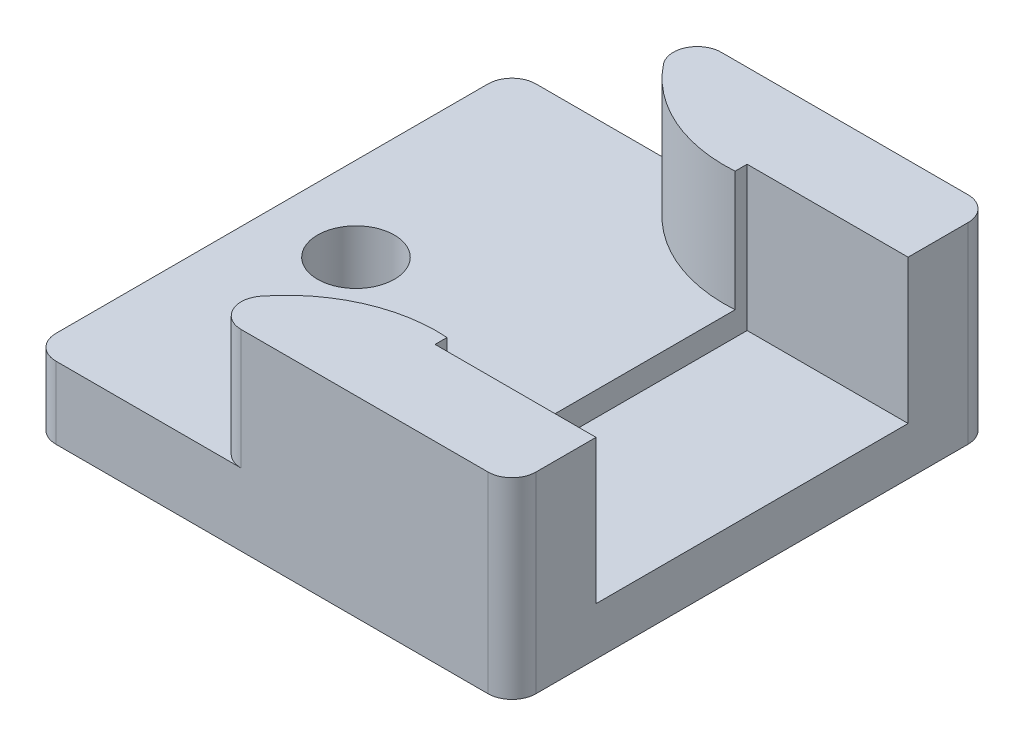
ISO-10303-21;
HEADER;
FILE_DESCRIPTION(('STEP AP214'),'2;1');
FILE_NAME('part.step','',(''),(''),'','','');
FILE_SCHEMA(('AUTOMOTIVE_DESIGN { 1 0 10303 214 1 1 1 1 }'));
ENDSEC;
DATA;
#1=APPLICATION_CONTEXT('core data for automotive mechanical design processes');
#2=APPLICATION_PROTOCOL_DEFINITION('international standard','automotive_design',2000,#1);
#3=PRODUCT_CONTEXT('',#1,'mechanical');
#4=PRODUCT('Part','Part','',(#3));
#5=PRODUCT_RELATED_PRODUCT_CATEGORY('part','',(#4));
#6=PRODUCT_DEFINITION_FORMATION('','',#4);
#7=PRODUCT_DEFINITION_CONTEXT('part definition',#1,'design');
#8=PRODUCT_DEFINITION('design','',#6,#7);
#9=PRODUCT_DEFINITION_SHAPE('','',#8);
#10=(LENGTH_UNIT() NAMED_UNIT(*) SI_UNIT(.MILLI.,.METRE.));
#11=(NAMED_UNIT(*) PLANE_ANGLE_UNIT() SI_UNIT($,.RADIAN.));
#12=(NAMED_UNIT(*) SI_UNIT($,.STERADIAN.) SOLID_ANGLE_UNIT());
#13=UNCERTAINTY_MEASURE_WITH_UNIT(LENGTH_MEASURE(1.E-05),#10,'distance_accuracy_value','');
#14=(GEOMETRIC_REPRESENTATION_CONTEXT(3) GLOBAL_UNCERTAINTY_ASSIGNED_CONTEXT((#13)) GLOBAL_UNIT_ASSIGNED_CONTEXT((#10,
#11,#12)) REPRESENTATION_CONTEXT('',''));
#15=CARTESIAN_POINT('',(0.,0.,0.));
#16=DIRECTION('',(0.,0.,1.));
#17=DIRECTION('',(1.,0.,0.));
#18=AXIS2_PLACEMENT_3D('',#15,#16,#17);
#19=CARTESIAN_POINT('',(-10.8433734939759,8.,-8.47389558232932));
#20=DIRECTION('',(1.,0.,0.));
#21=DIRECTION('',(0.,0.,-1.));
#22=AXIS2_PLACEMENT_3D('',#19,#20,#21);
#23=PLANE('',#22);
#24=DIRECTION('',(0.,0.,1.));
#25=VECTOR('',#24,1.);
#26=CARTESIAN_POINT('',(-10.8433734939759,3.,0.));
#27=LINE('',#26,#25);
#28=CARTESIAN_POINT('',(-10.8433734939759,3.,-7.47389558232932));
#29=VERTEX_POINT('',#28);
#30=CARTESIAN_POINT('',(-10.8433734939759,3.,10.5261044176707));
#31=VERTEX_POINT('',#30);
#32=EDGE_CURVE('E314',#29,#31,#27,.T.);
#33=ORIENTED_EDGE('',*,*,#32,.F.);
#34=DIRECTION('',(0.,-1.,0.));
#35=VECTOR('',#34,1.);
#36=CARTESIAN_POINT('',(-10.8433734939759,8.,-7.47389558232932));
#37=LINE('',#36,#35);
#38=CARTESIAN_POINT('',(-10.8433734939759,0.,-7.47389558232932));
#39=VERTEX_POINT('',#38);
#40=EDGE_CURVE('E284',#29,#39,#37,.T.);
#41=ORIENTED_EDGE('',*,*,#40,.T.);
#42=DIRECTION('',(0.,0.,1.));
#43=VECTOR('',#42,1.);
#44=CARTESIAN_POINT('',(-10.8433734939759,0.,-8.47389558232932));
#45=LINE('',#44,#43);
#46=CARTESIAN_POINT('',(-10.8433734939759,0.,10.5261044176707));
#47=VERTEX_POINT('',#46);
#48=EDGE_CURVE('E216',#39,#47,#45,.T.);
#49=ORIENTED_EDGE('',*,*,#48,.T.);
#50=DIRECTION('',(0.,-1.,0.));
#51=VECTOR('',#50,1.);
#52=CARTESIAN_POINT('',(-10.8433734939759,8.,10.5261044176707));
#53=LINE('',#52,#51);
#54=EDGE_CURVE('E48',#47,#31,#53,.F.);
#55=ORIENTED_EDGE('',*,*,#54,.T.);
#56=EDGE_LOOP('',(#33,#41,#49,#55));
#57=FACE_BOUND('',#56,.T.);
#58=ADVANCED_FACE('F33',(#57),#23,.F.);
#59=CARTESIAN_POINT('',(-10.8433734939759,8.,11.5261044176707));
#60=DIRECTION('',(0.,0.,-1.));
#61=DIRECTION('',(-1.,0.,0.));
#62=AXIS2_PLACEMENT_3D('',#59,#60,#61);
#63=PLANE('',#62);
#64=DIRECTION('',(1.,0.,0.));
#65=VECTOR('',#64,1.);
#66=CARTESIAN_POINT('',(-10.8433734939759,8.,11.5261044176707));
#67=LINE('',#66,#65);
#68=CARTESIAN_POINT('',(-2.1258573550839,8.,11.5261044176707));
#69=VERTEX_POINT('',#68);
#70=CARTESIAN_POINT('',(8.1566265060241,8.,11.5261044176707));
#71=VERTEX_POINT('',#70);
#72=EDGE_CURVE('E223',#69,#71,#67,.T.);
#73=ORIENTED_EDGE('',*,*,#72,.F.);
#74=DIRECTION('',(0.,-1.,0.));
#75=VECTOR('',#74,1.);
#76=CARTESIAN_POINT('',(-2.1258573550839,3.,11.5261044176707));
#77=LINE('',#76,#75);
#78=CARTESIAN_POINT('',(-2.1258573550839,3.,11.5261044176707));
#79=VERTEX_POINT('',#78);
#80=EDGE_CURVE('E267',#69,#79,#77,.T.);
#81=ORIENTED_EDGE('',*,*,#80,.T.);
#82=DIRECTION('',(1.,0.,0.));
#83=VECTOR('',#82,1.);
#84=CARTESIAN_POINT('',(0.,3.,11.5261044176707));
#85=LINE('',#84,#83);
#86=CARTESIAN_POINT('',(-9.84337349397591,3.,11.5261044176707));
#87=VERTEX_POINT('',#86);
#88=EDGE_CURVE('E190',#87,#79,#85,.T.);
#89=ORIENTED_EDGE('',*,*,#88,.F.);
#90=DIRECTION('',(0.,-1.,0.));
#91=VECTOR('',#90,1.);
#92=CARTESIAN_POINT('',(-9.84337349397591,8.,11.5261044176707));
#93=LINE('',#92,#91);
#94=CARTESIAN_POINT('',(-9.84337349397591,0.,11.5261044176707));
#95=VERTEX_POINT('',#94);
#96=EDGE_CURVE('E264',#87,#95,#93,.T.);
#97=ORIENTED_EDGE('',*,*,#96,.T.);
#98=DIRECTION('',(1.,0.,0.));
#99=VECTOR('',#98,1.);
#100=CARTESIAN_POINT('',(-10.8433734939759,0.,11.5261044176707));
#101=LINE('',#100,#99);
#102=CARTESIAN_POINT('',(8.1566265060241,0.,11.5261044176707));
#103=VERTEX_POINT('',#102);
#104=EDGE_CURVE('E235',#95,#103,#101,.T.);
#105=ORIENTED_EDGE('',*,*,#104,.T.);
#106=DIRECTION('',(0.,-1.,0.));
#107=VECTOR('',#106,1.);
#108=CARTESIAN_POINT('',(8.1566265060241,8.,11.5261044176707));
#109=LINE('',#108,#107);
#110=EDGE_CURVE('E262',#103,#71,#109,.F.);
#111=ORIENTED_EDGE('',*,*,#110,.T.);
#112=EDGE_LOOP('',(#73,#81,#89,#97,#105,#111));
#113=FACE_BOUND('',#112,.T.);
#114=ADVANCED_FACE('F343',(#113),#63,.F.);
#115=CARTESIAN_POINT('',(0.,8.,0.));
#116=DIRECTION('',(0.,1.,0.));
#117=DIRECTION('',(0.,0.,1.));
#118=AXIS2_PLACEMENT_3D('',#115,#116,#117);
#119=PLANE('',#118);
#120=CARTESIAN_POINT('',(2.02042580318857,8.,13.7850908464605));
#121=DIRECTION('',(0.,1.,0.));
#122=DIRECTION('',(0.,0.,1.));
#123=AXIS2_PLACEMENT_3D('',#120,#121,#122);
#124=CIRCLE('',#123,6.27377062182365);
#125=CARTESIAN_POINT('',(2.45087521889543,8.,7.52610441767068));
#126=VERTEX_POINT('',#125);
#127=CARTESIAN_POINT('',(-2.91206583011968,8.,9.90814306468661));
#128=VERTEX_POINT('',#127);
#129=EDGE_CURVE('E319',#126,#128,#124,.T.);
#130=ORIENTED_EDGE('',*,*,#129,.T.);
#131=CARTESIAN_POINT('',(-2.1258573550839,8.,10.5261044176707));
#132=DIRECTION('',(0.,1.,0.));
#133=DIRECTION('',(0.,0.,1.));
#134=AXIS2_PLACEMENT_3D('',#131,#132,#133);
#135=CIRCLE('',#134,1.);
#136=EDGE_CURVE('E260',#128,#69,#135,.T.);
#137=ORIENTED_EDGE('',*,*,#136,.T.);
#138=ORIENTED_EDGE('',*,*,#72,.T.);
#139=CARTESIAN_POINT('',(8.15662650602409,8.,10.5261044176707));
#140=DIRECTION('',(0.,1.,0.));
#141=DIRECTION('',(0.,0.,1.));
#142=AXIS2_PLACEMENT_3D('',#139,#140,#141);
#143=CIRCLE('',#142,1.);
#144=CARTESIAN_POINT('',(9.15662650602409,8.,10.5261044176707));
#145=VERTEX_POINT('',#144);
#146=EDGE_CURVE('E258',#71,#145,#143,.T.);
#147=ORIENTED_EDGE('',*,*,#146,.T.);
#148=DIRECTION('',(0.,0.,-1.));
#149=VECTOR('',#148,1.);
#150=CARTESIAN_POINT('',(9.15662650602409,8.,-8.47389558232932));
#151=LINE('',#150,#149);
#152=CARTESIAN_POINT('',(9.15662650602409,8.,8.02610441767068));
#153=VERTEX_POINT('',#152);
#154=EDGE_CURVE('E228',#145,#153,#151,.T.);
#155=ORIENTED_EDGE('',*,*,#154,.T.);
#156=DIRECTION('',(1.,0.,0.));
#157=VECTOR('',#156,1.);
#158=CARTESIAN_POINT('',(9.15662650602409,8.,8.02610441767068));
#159=LINE('',#158,#157);
#160=CARTESIAN_POINT('',(2.45087521889543,8.,8.02610441767068));
#161=VERTEX_POINT('',#160);
#162=EDGE_CURVE('E200',#161,#153,#159,.T.);
#163=ORIENTED_EDGE('',*,*,#162,.F.);
#164=DIRECTION('',(0.,0.,1.));
#165=VECTOR('',#164,1.);
#166=CARTESIAN_POINT('',(2.45087521889543,8.,-4.97389558232932));
#167=LINE('',#166,#165);
#168=EDGE_CURVE('E188',#126,#161,#167,.T.);
#169=ORIENTED_EDGE('',*,*,#168,.F.);
#170=EDGE_LOOP('',(#130,#137,#138,#147,#155,#163,#169));
#171=FACE_BOUND('',#170,.T.);
#172=ADVANCED_FACE('F340',(#171),#119,.T.);
#173=CARTESIAN_POINT('',(2.45087521889543,2.,-4.97389558232932));
#174=DIRECTION('',(-1.,0.,0.));
#175=DIRECTION('',(0.,0.,1.));
#176=AXIS2_PLACEMENT_3D('',#173,#174,#175);
#177=PLANE('',#176);
#178=DIRECTION('',(0.,1.,0.));
#179=VECTOR('',#178,1.);
#180=CARTESIAN_POINT('',(2.45087521889543,3.,7.52610441767068));
#181=LINE('',#180,#179);
#182=CARTESIAN_POINT('',(2.45087521889543,3.,7.52610441767068));
#183=VERTEX_POINT('',#182);
#184=EDGE_CURVE('E185',#183,#126,#181,.T.);
#185=ORIENTED_EDGE('',*,*,#184,.T.);
#186=ORIENTED_EDGE('',*,*,#168,.T.);
#187=DIRECTION('',(0.,1.,0.));
#188=VECTOR('',#187,1.);
#189=CARTESIAN_POINT('',(2.45087521889543,2.,8.02610441767068));
#190=LINE('',#189,#188);
#191=CARTESIAN_POINT('',(2.45087521889543,2.,8.02610441767068));
#192=VERTEX_POINT('',#191);
#193=EDGE_CURVE('E217',#192,#161,#190,.T.);
#194=ORIENTED_EDGE('',*,*,#193,.F.);
#195=DIRECTION('',(0.,0.,1.));
#196=VECTOR('',#195,1.);
#197=CARTESIAN_POINT('',(2.45087521889543,2.,-4.97389558232932));
#198=LINE('',#197,#196);
#199=CARTESIAN_POINT('',(2.45087521889543,2.,-4.97389558232932));
#200=VERTEX_POINT('',#199);
#201=EDGE_CURVE('E203',#200,#192,#198,.T.);
#202=ORIENTED_EDGE('',*,*,#201,.F.);
#203=DIRECTION('',(0.,1.,0.));
#204=VECTOR('',#203,1.);
#205=CARTESIAN_POINT('',(2.45087521889543,2.,-4.97389558232932));
#206=LINE('',#205,#204);
#207=CARTESIAN_POINT('',(2.45087521889543,8.,-4.97389558232932));
#208=VERTEX_POINT('',#207);
#209=EDGE_CURVE('E220',#200,#208,#206,.T.);
#210=ORIENTED_EDGE('',*,*,#209,.T.);
#211=CARTESIAN_POINT('',(2.45087521889543,8.,-4.47389558232932));
#212=VERTEX_POINT('',#211);
#213=EDGE_CURVE('E183',#208,#212,#167,.T.);
#214=ORIENTED_EDGE('',*,*,#213,.T.);
#215=DIRECTION('',(0.,1.,0.));
#216=VECTOR('',#215,1.);
#217=CARTESIAN_POINT('',(2.45087521889543,3.,-4.47389558232932));
#218=LINE('',#217,#216);
#219=CARTESIAN_POINT('',(2.45087521889543,3.,-4.47389558232932));
#220=VERTEX_POINT('',#219);
#221=EDGE_CURVE('E163',#220,#212,#218,.T.);
#222=ORIENTED_EDGE('',*,*,#221,.F.);
#223=DIRECTION('',(0.,0.,-1.));
#224=VECTOR('',#223,1.);
#225=CARTESIAN_POINT('',(2.45087521889543,3.,0.));
#226=LINE('',#225,#224);
#227=EDGE_CURVE('E170',#183,#220,#226,.T.);
#228=ORIENTED_EDGE('',*,*,#227,.F.);
#229=EDGE_LOOP('',(#185,#186,#194,#202,#210,#214,#222,#228));
#230=FACE_BOUND('',#229,.T.);
#231=ADVANCED_FACE('F181',(#230),#177,.F.);
#232=CARTESIAN_POINT('',(9.15662650602409,8.,-8.47389558232932));
#233=DIRECTION('',(-1.,0.,0.));
#234=DIRECTION('',(0.,0.,1.));
#235=AXIS2_PLACEMENT_3D('',#232,#233,#234);
#236=PLANE('',#235);
#237=DIRECTION('',(0.,0.,-1.));
#238=VECTOR('',#237,1.);
#239=CARTESIAN_POINT('',(9.15662650602409,0.,-8.47389558232932));
#240=LINE('',#239,#238);
#241=CARTESIAN_POINT('',(9.15662650602409,0.,10.5261044176707));
#242=VERTEX_POINT('',#241);
#243=CARTESIAN_POINT('',(9.15662650602409,0.,-7.47389558232932));
#244=VERTEX_POINT('',#243);
#245=EDGE_CURVE('E238',#242,#244,#240,.T.);
#246=ORIENTED_EDGE('',*,*,#245,.T.);
#247=DIRECTION('',(0.,-1.,0.));
#248=VECTOR('',#247,1.);
#249=CARTESIAN_POINT('',(9.15662650602409,8.,-7.47389558232932));
#250=LINE('',#249,#248);
#251=CARTESIAN_POINT('',(9.15662650602409,8.,-7.47389558232932));
#252=VERTEX_POINT('',#251);
#253=EDGE_CURVE('E281',#244,#252,#250,.F.);
#254=ORIENTED_EDGE('',*,*,#253,.T.);
#255=CARTESIAN_POINT('',(9.15662650602409,8.,-4.97389558232932));
#256=VERTEX_POINT('',#255);
#257=EDGE_CURVE('E226',#256,#252,#151,.T.);
#258=ORIENTED_EDGE('',*,*,#257,.F.);
#259=DIRECTION('',(0.,1.,0.));
#260=VECTOR('',#259,1.);
#261=CARTESIAN_POINT('',(9.15662650602409,2.,-4.97389558232932));
#262=LINE('',#261,#260);
#263=CARTESIAN_POINT('',(9.15662650602409,2.,-4.97389558232932));
#264=VERTEX_POINT('',#263);
#265=EDGE_CURVE('E208',#264,#256,#262,.T.);
#266=ORIENTED_EDGE('',*,*,#265,.F.);
#267=DIRECTION('',(0.,0.,-1.));
#268=VECTOR('',#267,1.);
#269=CARTESIAN_POINT('',(9.15662650602409,2.,-4.97389558232932));
#270=LINE('',#269,#268);
#271=CARTESIAN_POINT('',(9.15662650602409,2.,8.02610441767068));
#272=VERTEX_POINT('',#271);
#273=EDGE_CURVE('E196',#272,#264,#270,.T.);
#274=ORIENTED_EDGE('',*,*,#273,.F.);
#275=DIRECTION('',(0.,1.,0.));
#276=VECTOR('',#275,1.);
#277=CARTESIAN_POINT('',(9.15662650602409,2.,8.02610441767068));
#278=LINE('',#277,#276);
#279=EDGE_CURVE('E213',#272,#153,#278,.T.);
#280=ORIENTED_EDGE('',*,*,#279,.T.);
#281=ORIENTED_EDGE('',*,*,#154,.F.);
#282=DIRECTION('',(0.,-1.,0.));
#283=VECTOR('',#282,1.);
#284=CARTESIAN_POINT('',(9.15662650602409,8.,10.5261044176707));
#285=LINE('',#284,#283);
#286=EDGE_CURVE('E278',#145,#242,#285,.T.);
#287=ORIENTED_EDGE('',*,*,#286,.T.);
#288=EDGE_LOOP('',(#246,#254,#258,#266,#274,#280,#281,#287));
#289=FACE_BOUND('',#288,.T.);
#290=ADVANCED_FACE('F352',(#289),#236,.F.);
#291=CARTESIAN_POINT('',(-10.8433734939759,8.,-8.47389558232932));
#292=DIRECTION('',(0.,0.,1.));
#293=DIRECTION('',(1.,0.,0.));
#294=AXIS2_PLACEMENT_3D('',#291,#292,#293);
#295=PLANE('',#294);
#296=DIRECTION('',(-1.,0.,0.));
#297=VECTOR('',#296,1.);
#298=CARTESIAN_POINT('',(0.,3.,-8.47389558232932));
#299=LINE('',#298,#297);
#300=CARTESIAN_POINT('',(-2.12585735508389,3.,-8.47389558232932));
#301=VERTEX_POINT('',#300);
#302=CARTESIAN_POINT('',(-9.84337349397591,3.,-8.47389558232932));
#303=VERTEX_POINT('',#302);
#304=EDGE_CURVE('E169',#301,#303,#299,.T.);
#305=ORIENTED_EDGE('',*,*,#304,.F.);
#306=DIRECTION('',(0.,1.,0.));
#307=VECTOR('',#306,1.);
#308=CARTESIAN_POINT('',(-2.12585735508389,8.,-8.47389558232932));
#309=LINE('',#308,#307);
#310=CARTESIAN_POINT('',(-2.12585735508389,8.,-8.47389558232932));
#311=VERTEX_POINT('',#310);
#312=EDGE_CURVE('E247',#301,#311,#309,.T.);
#313=ORIENTED_EDGE('',*,*,#312,.T.);
#314=DIRECTION('',(-1.,0.,0.));
#315=VECTOR('',#314,1.);
#316=CARTESIAN_POINT('',(-10.8433734939759,8.,-8.47389558232932));
#317=LINE('',#316,#315);
#318=CARTESIAN_POINT('',(8.15662650602409,8.,-8.47389558232932));
#319=VERTEX_POINT('',#318);
#320=EDGE_CURVE('E230',#319,#311,#317,.T.);
#321=ORIENTED_EDGE('',*,*,#320,.F.);
#322=DIRECTION('',(0.,-1.,0.));
#323=VECTOR('',#322,1.);
#324=CARTESIAN_POINT('',(8.15662650602409,8.,-8.47389558232932));
#325=LINE('',#324,#323);
#326=CARTESIAN_POINT('',(8.15662650602409,0.,-8.47389558232932));
#327=VERTEX_POINT('',#326);
#328=EDGE_CURVE('E244',#319,#327,#325,.T.);
#329=ORIENTED_EDGE('',*,*,#328,.T.);
#330=DIRECTION('',(-1.,0.,0.));
#331=VECTOR('',#330,1.);
#332=CARTESIAN_POINT('',(-10.8433734939759,0.,-8.47389558232932));
#333=LINE('',#332,#331);
#334=CARTESIAN_POINT('',(-9.84337349397591,0.,-8.47389558232932));
#335=VERTEX_POINT('',#334);
#336=EDGE_CURVE('E227',#327,#335,#333,.T.);
#337=ORIENTED_EDGE('',*,*,#336,.T.);
#338=DIRECTION('',(0.,-1.,0.));
#339=VECTOR('',#338,1.);
#340=CARTESIAN_POINT('',(-9.84337349397591,8.,-8.47389558232932));
#341=LINE('',#340,#339);
#342=EDGE_CURVE('E233',#335,#303,#341,.F.);
#343=ORIENTED_EDGE('',*,*,#342,.T.);
#344=EDGE_LOOP('',(#305,#313,#321,#329,#337,#343));
#345=FACE_BOUND('',#344,.T.);
#346=ADVANCED_FACE('F294',(#345),#295,.F.);
#347=ORIENTED_EDGE('',*,*,#320,.T.);
#348=CARTESIAN_POINT('',(-2.12585735508389,8.,-7.47389558232932));
#349=DIRECTION('',(0.,1.,0.));
#350=DIRECTION('',(0.,0.,1.));
#351=AXIS2_PLACEMENT_3D('',#348,#349,#350);
#352=CIRCLE('',#351,1.);
#353=CARTESIAN_POINT('',(-2.91206583011967,8.,-6.85593422934524));
#354=VERTEX_POINT('',#353);
#355=EDGE_CURVE('E252',#311,#354,#352,.T.);
#356=ORIENTED_EDGE('',*,*,#355,.T.);
#357=CARTESIAN_POINT('',(2.02042580318859,8.,-10.7328820111191));
#358=DIRECTION('',(0.,1.,0.));
#359=DIRECTION('',(0.,0.,1.));
#360=AXIS2_PLACEMENT_3D('',#357,#358,#359);
#361=CIRCLE('',#360,6.27377062182364);
#362=EDGE_CURVE('E193',#212,#354,#361,.F.);
#363=ORIENTED_EDGE('',*,*,#362,.F.);
#364=ORIENTED_EDGE('',*,*,#213,.F.);
#365=DIRECTION('',(-1.,0.,0.));
#366=VECTOR('',#365,1.);
#367=CARTESIAN_POINT('',(9.15662650602409,8.,-4.97389558232932));
#368=LINE('',#367,#366);
#369=EDGE_CURVE('E184',#256,#208,#368,.T.);
#370=ORIENTED_EDGE('',*,*,#369,.F.);
#371=ORIENTED_EDGE('',*,*,#257,.T.);
#372=CARTESIAN_POINT('',(8.15662650602409,8.,-7.47389558232932));
#373=DIRECTION('',(0.,1.,0.));
#374=DIRECTION('',(0.,0.,1.));
#375=AXIS2_PLACEMENT_3D('',#372,#373,#374);
#376=CIRCLE('',#375,1.);
#377=EDGE_CURVE('E250',#252,#319,#376,.T.);
#378=ORIENTED_EDGE('',*,*,#377,.T.);
#379=EDGE_LOOP('',(#347,#356,#363,#364,#370,#371,#378));
#380=FACE_BOUND('',#379,.T.);
#381=ADVANCED_FACE('F297',(#380),#119,.T.);
#382=CARTESIAN_POINT('',(0.,0.,0.));
#383=DIRECTION('',(0.,1.,0.));
#384=DIRECTION('',(0.,0.,1.));
#385=AXIS2_PLACEMENT_3D('',#382,#383,#384);
#386=PLANE('',#385);
#387=CARTESIAN_POINT('',(-7.34337349397591,0.,1.52610441767068));
#388=DIRECTION('',(0.,1.,0.));
#389=DIRECTION('',(0.,0.,1.));
#390=AXIS2_PLACEMENT_3D('',#387,#388,#389);
#391=CIRCLE('',#390,1.6);
#392=CARTESIAN_POINT('',(-7.34337349397591,0.,3.12610441767068));
#393=VERTEX_POINT('',#392);
#394=EDGE_CURVE('E321',#393,#393,#391,.T.);
#395=ORIENTED_EDGE('',*,*,#394,.T.);
#396=EDGE_LOOP('',(#395));
#397=FACE_BOUND('',#396,.T.);
#398=ORIENTED_EDGE('',*,*,#336,.F.);
#399=CARTESIAN_POINT('',(8.15662650602409,0.,-7.47389558232932));
#400=DIRECTION('',(0.,1.,0.));
#401=DIRECTION('',(0.,0.,1.));
#402=AXIS2_PLACEMENT_3D('',#399,#400,#401);
#403=CIRCLE('',#402,1.);
#404=EDGE_CURVE('E276',#327,#244,#403,.F.);
#405=ORIENTED_EDGE('',*,*,#404,.T.);
#406=ORIENTED_EDGE('',*,*,#245,.F.);
#407=CARTESIAN_POINT('',(8.15662650602409,0.,10.5261044176707));
#408=DIRECTION('',(0.,1.,0.));
#409=DIRECTION('',(0.,0.,1.));
#410=AXIS2_PLACEMENT_3D('',#407,#408,#409);
#411=CIRCLE('',#410,1.);
#412=EDGE_CURVE('E270',#242,#103,#411,.F.);
#413=ORIENTED_EDGE('',*,*,#412,.T.);
#414=ORIENTED_EDGE('',*,*,#104,.F.);
#415=CARTESIAN_POINT('',(-9.84337349397591,0.,10.5261044176707));
#416=DIRECTION('',(0.,1.,0.));
#417=DIRECTION('',(0.,0.,1.));
#418=AXIS2_PLACEMENT_3D('',#415,#416,#417);
#419=CIRCLE('',#418,1.);
#420=EDGE_CURVE('E272',#95,#47,#419,.F.);
#421=ORIENTED_EDGE('',*,*,#420,.T.);
#422=ORIENTED_EDGE('',*,*,#48,.F.);
#423=CARTESIAN_POINT('',(-9.84337349397591,0.,-7.47389558232932));
#424=DIRECTION('',(0.,1.,0.));
#425=DIRECTION('',(0.,0.,1.));
#426=AXIS2_PLACEMENT_3D('',#423,#424,#425);
#427=CIRCLE('',#426,1.);
#428=EDGE_CURVE('E274',#39,#335,#427,.F.);
#429=ORIENTED_EDGE('',*,*,#428,.T.);
#430=EDGE_LOOP('',(#398,#405,#406,#413,#414,#421,#422,#429));
#431=FACE_BOUND('',#430,.T.);
#432=ADVANCED_FACE('F308',(#397,#431),#386,.F.);
#433=CARTESIAN_POINT('',(9.15662650602409,2.,8.02610441767068));
#434=DIRECTION('',(0.,0.,1.));
#435=DIRECTION('',(1.,0.,0.));
#436=AXIS2_PLACEMENT_3D('',#433,#434,#435);
#437=PLANE('',#436);
#438=ORIENTED_EDGE('',*,*,#162,.T.);
#439=ORIENTED_EDGE('',*,*,#279,.F.);
#440=DIRECTION('',(1.,0.,0.));
#441=VECTOR('',#440,1.);
#442=CARTESIAN_POINT('',(9.15662650602409,2.,8.02610441767068));
#443=LINE('',#442,#441);
#444=EDGE_CURVE('E206',#192,#272,#443,.T.);
#445=ORIENTED_EDGE('',*,*,#444,.F.);
#446=ORIENTED_EDGE('',*,*,#193,.T.);
#447=EDGE_LOOP('',(#438,#439,#445,#446));
#448=FACE_BOUND('',#447,.T.);
#449=ADVANCED_FACE('F357',(#448),#437,.F.);
#450=CARTESIAN_POINT('',(9.15662650602409,2.,-4.97389558232932));
#451=DIRECTION('',(0.,0.,-1.));
#452=DIRECTION('',(-1.,0.,0.));
#453=AXIS2_PLACEMENT_3D('',#450,#451,#452);
#454=PLANE('',#453);
#455=ORIENTED_EDGE('',*,*,#369,.T.);
#456=ORIENTED_EDGE('',*,*,#209,.F.);
#457=DIRECTION('',(-1.,0.,0.));
#458=VECTOR('',#457,1.);
#459=CARTESIAN_POINT('',(9.15662650602409,2.,-4.97389558232932));
#460=LINE('',#459,#458);
#461=EDGE_CURVE('E199',#264,#200,#460,.T.);
#462=ORIENTED_EDGE('',*,*,#461,.F.);
#463=ORIENTED_EDGE('',*,*,#265,.T.);
#464=EDGE_LOOP('',(#455,#456,#462,#463));
#465=FACE_BOUND('',#464,.T.);
#466=ADVANCED_FACE('F362',(#465),#454,.F.);
#467=CARTESIAN_POINT('',(0.,2.,0.));
#468=DIRECTION('',(0.,-1.,0.));
#469=DIRECTION('',(0.,0.,-1.));
#470=AXIS2_PLACEMENT_3D('',#467,#468,#469);
#471=PLANE('',#470);
#472=ORIENTED_EDGE('',*,*,#273,.T.);
#473=ORIENTED_EDGE('',*,*,#461,.T.);
#474=ORIENTED_EDGE('',*,*,#201,.T.);
#475=ORIENTED_EDGE('',*,*,#444,.T.);
#476=EDGE_LOOP('',(#472,#473,#474,#475));
#477=FACE_BOUND('',#476,.T.);
#478=ADVANCED_FACE('F359',(#477),#471,.F.);
#479=CARTESIAN_POINT('',(2.02042580318857,3.,13.7850908464605));
#480=DIRECTION('',(0.,1.,0.));
#481=DIRECTION('',(0.,0.,1.));
#482=AXIS2_PLACEMENT_3D('',#479,#480,#481);
#483=CYLINDRICAL_SURFACE('',#482,6.27377062182365);
#484=CARTESIAN_POINT('',(2.02042580318857,3.,13.7850908464605));
#485=DIRECTION('',(0.,1.,0.));
#486=DIRECTION('',(0.,0.,1.));
#487=AXIS2_PLACEMENT_3D('',#484,#485,#486);
#488=CIRCLE('',#487,6.27377062182365);
#489=CARTESIAN_POINT('',(-2.91206583011968,3.,9.90814306468661));
#490=VERTEX_POINT('',#489);
#491=EDGE_CURVE('E175',#183,#490,#488,.T.);
#492=ORIENTED_EDGE('',*,*,#491,.T.);
#493=DIRECTION('',(0.,1.,0.));
#494=VECTOR('',#493,1.);
#495=CARTESIAN_POINT('',(-2.91206583011968,3.,9.90814306468661));
#496=LINE('',#495,#494);
#497=EDGE_CURVE('E255',#490,#128,#496,.T.);
#498=ORIENTED_EDGE('',*,*,#497,.T.);
#499=ORIENTED_EDGE('',*,*,#129,.F.);
#500=ORIENTED_EDGE('',*,*,#184,.F.);
#501=EDGE_LOOP('',(#492,#498,#499,#500));
#502=FACE_BOUND('',#501,.T.);
#503=ADVANCED_FACE('F334',(#502),#483,.T.);
#504=CARTESIAN_POINT('',(2.02042580318859,3.,-10.7328820111191));
#505=DIRECTION('',(0.,1.,0.));
#506=DIRECTION('',(0.,0.,1.));
#507=AXIS2_PLACEMENT_3D('',#504,#505,#506);
#508=CYLINDRICAL_SURFACE('',#507,6.27377062182364);
#509=ORIENTED_EDGE('',*,*,#362,.T.);
#510=DIRECTION('',(0.,1.,0.));
#511=VECTOR('',#510,1.);
#512=CARTESIAN_POINT('',(-2.91206583011967,3.,-6.85593422934524));
#513=LINE('',#512,#511);
#514=CARTESIAN_POINT('',(-2.91206583011967,3.,-6.85593422934524));
#515=VERTEX_POINT('',#514);
#516=EDGE_CURVE('E166',#354,#515,#513,.F.);
#517=ORIENTED_EDGE('',*,*,#516,.T.);
#518=CARTESIAN_POINT('',(2.02042580318859,3.,-10.7328820111191));
#519=DIRECTION('',(0.,1.,0.));
#520=DIRECTION('',(0.,0.,1.));
#521=AXIS2_PLACEMENT_3D('',#518,#519,#520);
#522=CIRCLE('',#521,6.27377062182364);
#523=EDGE_CURVE('E158',#220,#515,#522,.F.);
#524=ORIENTED_EDGE('',*,*,#523,.F.);
#525=ORIENTED_EDGE('',*,*,#221,.T.);
#526=EDGE_LOOP('',(#509,#517,#524,#525));
#527=FACE_BOUND('',#526,.T.);
#528=ADVANCED_FACE('F161',(#527),#508,.T.);
#529=CARTESIAN_POINT('',(0.,3.,0.));
#530=DIRECTION('',(0.,1.,0.));
#531=DIRECTION('',(0.,0.,1.));
#532=AXIS2_PLACEMENT_3D('',#529,#530,#531);
#533=PLANE('',#532);
#534=CARTESIAN_POINT('',(-7.34337349397591,3.,1.52610441767068));
#535=DIRECTION('',(0.,1.,0.));
#536=DIRECTION('',(0.,0.,1.));
#537=AXIS2_PLACEMENT_3D('',#534,#535,#536);
#538=CIRCLE('',#537,1.6);
#539=CARTESIAN_POINT('',(-7.34337349397591,3.,3.12610441767068));
#540=VERTEX_POINT('',#539);
#541=EDGE_CURVE('E325',#540,#540,#538,.T.);
#542=ORIENTED_EDGE('',*,*,#541,.F.);
#543=EDGE_LOOP('',(#542));
#544=FACE_BOUND('',#543,.T.);
#545=ORIENTED_EDGE('',*,*,#304,.T.);
#546=CARTESIAN_POINT('',(-9.84337349397591,3.,-7.47389558232932));
#547=DIRECTION('',(0.,1.,0.));
#548=DIRECTION('',(0.,0.,1.));
#549=AXIS2_PLACEMENT_3D('',#546,#547,#548);
#550=CIRCLE('',#549,1.);
#551=EDGE_CURVE('E55',#303,#29,#550,.T.);
#552=ORIENTED_EDGE('',*,*,#551,.T.);
#553=ORIENTED_EDGE('',*,*,#32,.T.);
#554=CARTESIAN_POINT('',(-9.84337349397591,3.,10.5261044176707));
#555=DIRECTION('',(0.,1.,0.));
#556=DIRECTION('',(0.,0.,1.));
#557=AXIS2_PLACEMENT_3D('',#554,#555,#556);
#558=CIRCLE('',#557,1.);
#559=EDGE_CURVE('E287',#31,#87,#558,.T.);
#560=ORIENTED_EDGE('',*,*,#559,.T.);
#561=ORIENTED_EDGE('',*,*,#88,.T.);
#562=CARTESIAN_POINT('',(-2.1258573550839,3.,10.5261044176707));
#563=DIRECTION('',(0.,1.,0.));
#564=DIRECTION('',(0.,0.,1.));
#565=AXIS2_PLACEMENT_3D('',#562,#563,#564);
#566=CIRCLE('',#565,1.);
#567=EDGE_CURVE('E11',#79,#490,#566,.F.);
#568=ORIENTED_EDGE('',*,*,#567,.T.);
#569=ORIENTED_EDGE('',*,*,#491,.F.);
#570=ORIENTED_EDGE('',*,*,#227,.T.);
#571=ORIENTED_EDGE('',*,*,#523,.T.);
#572=CARTESIAN_POINT('',(-2.12585735508389,3.,-7.47389558232932));
#573=DIRECTION('',(0.,1.,0.));
#574=DIRECTION('',(0.,0.,1.));
#575=AXIS2_PLACEMENT_3D('',#572,#573,#574);
#576=CIRCLE('',#575,1.);
#577=EDGE_CURVE('E41',#515,#301,#576,.F.);
#578=ORIENTED_EDGE('',*,*,#577,.T.);
#579=EDGE_LOOP('',(#545,#552,#553,#560,#561,#568,#569,#570,#571,#578));
#580=FACE_BOUND('',#579,.T.);
#581=ADVANCED_FACE('F173',(#544,#580),#533,.T.);
#582=CARTESIAN_POINT('',(-7.34337349397591,0.,1.52610441767068));
#583=DIRECTION('',(0.,1.,0.));
#584=DIRECTION('',(0.,0.,1.));
#585=AXIS2_PLACEMENT_3D('',#582,#583,#584);
#586=CYLINDRICAL_SURFACE('',#585,1.6);
#587=ORIENTED_EDGE('',*,*,#394,.F.);
#588=EDGE_LOOP('',(#587));
#589=FACE_BOUND('',#588,.T.);
#590=ORIENTED_EDGE('',*,*,#541,.T.);
#591=EDGE_LOOP('',(#590));
#592=FACE_BOUND('',#591,.T.);
#593=ADVANCED_FACE('F382',(#589,#592),#586,.F.);
#594=CARTESIAN_POINT('',(-2.12585735508389,3.,-7.47389558232932));
#595=DIRECTION('',(0.,1.,0.));
#596=DIRECTION('',(0.,0.,1.));
#597=AXIS2_PLACEMENT_3D('',#594,#595,#596);
#598=CYLINDRICAL_SURFACE('',#597,1.);
#599=ORIENTED_EDGE('',*,*,#577,.F.);
#600=ORIENTED_EDGE('',*,*,#516,.F.);
#601=ORIENTED_EDGE('',*,*,#355,.F.);
#602=ORIENTED_EDGE('',*,*,#312,.F.);
#603=EDGE_LOOP('',(#599,#600,#601,#602));
#604=FACE_BOUND('',#603,.T.);
#605=ADVANCED_FACE('F291',(#604),#598,.T.);
#606=CARTESIAN_POINT('',(-2.1258573550839,3.,10.5261044176707));
#607=DIRECTION('',(0.,1.,0.));
#608=DIRECTION('',(0.,0.,1.));
#609=AXIS2_PLACEMENT_3D('',#606,#607,#608);
#610=CYLINDRICAL_SURFACE('',#609,1.);
#611=ORIENTED_EDGE('',*,*,#567,.F.);
#612=ORIENTED_EDGE('',*,*,#80,.F.);
#613=ORIENTED_EDGE('',*,*,#136,.F.);
#614=ORIENTED_EDGE('',*,*,#497,.F.);
#615=EDGE_LOOP('',(#611,#612,#613,#614));
#616=FACE_BOUND('',#615,.T.);
#617=ADVANCED_FACE('F337',(#616),#610,.T.);
#618=CARTESIAN_POINT('',(8.15662650602409,8.,-7.47389558232932));
#619=DIRECTION('',(0.,-1.,0.));
#620=DIRECTION('',(0.,0.,-1.));
#621=AXIS2_PLACEMENT_3D('',#618,#619,#620);
#622=CYLINDRICAL_SURFACE('',#621,1.);
#623=ORIENTED_EDGE('',*,*,#377,.F.);
#624=ORIENTED_EDGE('',*,*,#253,.F.);
#625=ORIENTED_EDGE('',*,*,#404,.F.);
#626=ORIENTED_EDGE('',*,*,#328,.F.);
#627=EDGE_LOOP('',(#623,#624,#625,#626));
#628=FACE_BOUND('',#627,.T.);
#629=ADVANCED_FACE('F304',(#628),#622,.T.);
#630=CARTESIAN_POINT('',(-9.84337349397591,8.,-7.47389558232932));
#631=DIRECTION('',(0.,-1.,0.));
#632=DIRECTION('',(0.,0.,-1.));
#633=AXIS2_PLACEMENT_3D('',#630,#631,#632);
#634=CYLINDRICAL_SURFACE('',#633,1.);
#635=ORIENTED_EDGE('',*,*,#551,.F.);
#636=ORIENTED_EDGE('',*,*,#342,.F.);
#637=ORIENTED_EDGE('',*,*,#428,.F.);
#638=ORIENTED_EDGE('',*,*,#40,.F.);
#639=EDGE_LOOP('',(#635,#636,#637,#638));
#640=FACE_BOUND('',#639,.T.);
#641=ADVANCED_FACE('F313',(#640),#634,.T.);
#642=CARTESIAN_POINT('',(-9.84337349397591,8.,10.5261044176707));
#643=DIRECTION('',(0.,-1.,0.));
#644=DIRECTION('',(0.,0.,-1.));
#645=AXIS2_PLACEMENT_3D('',#642,#643,#644);
#646=CYLINDRICAL_SURFACE('',#645,1.);
#647=ORIENTED_EDGE('',*,*,#559,.F.);
#648=ORIENTED_EDGE('',*,*,#54,.F.);
#649=ORIENTED_EDGE('',*,*,#420,.F.);
#650=ORIENTED_EDGE('',*,*,#96,.F.);
#651=EDGE_LOOP('',(#647,#648,#649,#650));
#652=FACE_BOUND('',#651,.T.);
#653=ADVANCED_FACE('F365',(#652),#646,.T.);
#654=CARTESIAN_POINT('',(8.15662650602409,8.,10.5261044176707));
#655=DIRECTION('',(0.,-1.,0.));
#656=DIRECTION('',(0.,0.,-1.));
#657=AXIS2_PLACEMENT_3D('',#654,#655,#656);
#658=CYLINDRICAL_SURFACE('',#657,1.);
#659=ORIENTED_EDGE('',*,*,#146,.F.);
#660=ORIENTED_EDGE('',*,*,#110,.F.);
#661=ORIENTED_EDGE('',*,*,#412,.F.);
#662=ORIENTED_EDGE('',*,*,#286,.F.);
#663=EDGE_LOOP('',(#659,#660,#661,#662));
#664=FACE_BOUND('',#663,.T.);
#665=ADVANCED_FACE('F35',(#664),#658,.T.);
#666=CLOSED_SHELL('',(#58,#114,#172,#231,#290,#346,#381,#432,#449,#466,#478,#503,#528,#581,#593,
#605,#617,#629,#641,#653,#665));
#667=MANIFOLD_SOLID_BREP('B2',#666);
#668=ADVANCED_BREP_SHAPE_REPRESENTATION('',(#18,#667),#14);
#669=SHAPE_DEFINITION_REPRESENTATION(#9,#668);
ENDSEC;
END-ISO-10303-21;
